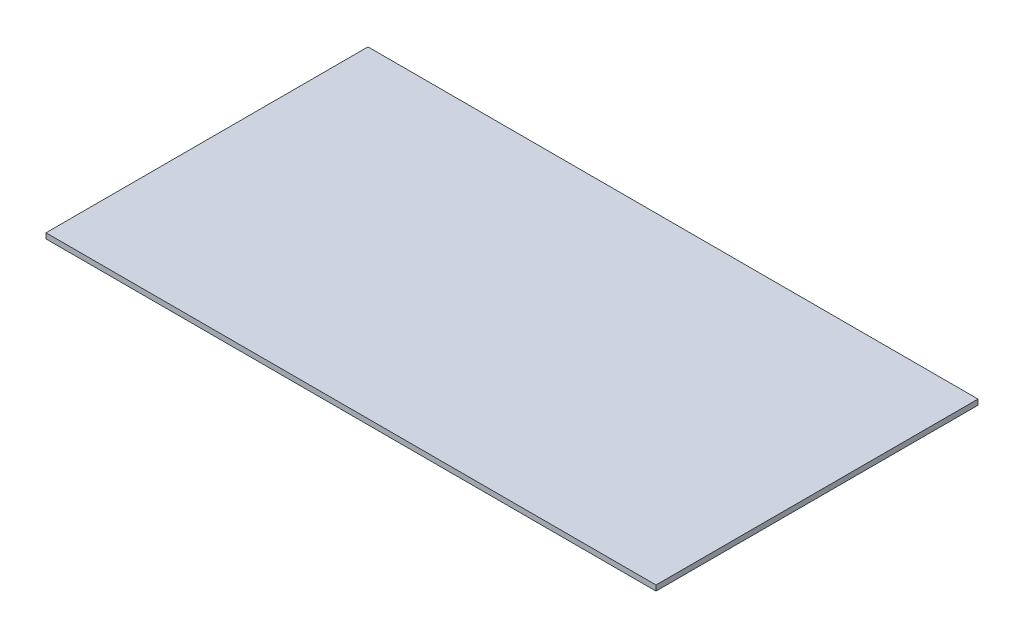
ISO-10303-21;
HEADER;
FILE_DESCRIPTION(('STEP AP214'),'2;1');
FILE_NAME('part.step','',(''),(''),'','','');
FILE_SCHEMA(('AUTOMOTIVE_DESIGN { 1 0 10303 214 1 1 1 1 }'));
ENDSEC;
DATA;
#1=APPLICATION_CONTEXT('core data for automotive mechanical design processes');
#2=APPLICATION_PROTOCOL_DEFINITION('international standard','automotive_design',2000,#1);
#3=PRODUCT_CONTEXT('',#1,'mechanical');
#4=PRODUCT('Part','Part','',(#3));
#5=PRODUCT_RELATED_PRODUCT_CATEGORY('part','',(#4));
#6=PRODUCT_DEFINITION_FORMATION('','',#4);
#7=PRODUCT_DEFINITION_CONTEXT('part definition',#1,'design');
#8=PRODUCT_DEFINITION('design','',#6,#7);
#9=PRODUCT_DEFINITION_SHAPE('','',#8);
#10=(LENGTH_UNIT() NAMED_UNIT(*) SI_UNIT(.MILLI.,.METRE.));
#11=(NAMED_UNIT(*) PLANE_ANGLE_UNIT() SI_UNIT($,.RADIAN.));
#12=(NAMED_UNIT(*) SI_UNIT($,.STERADIAN.) SOLID_ANGLE_UNIT());
#13=UNCERTAINTY_MEASURE_WITH_UNIT(LENGTH_MEASURE(1.E-05),#10,'distance_accuracy_value','');
#14=(GEOMETRIC_REPRESENTATION_CONTEXT(3) GLOBAL_UNCERTAINTY_ASSIGNED_CONTEXT((#13)) GLOBAL_UNIT_ASSIGNED_CONTEXT((#10,
#11,#12)) REPRESENTATION_CONTEXT('',''));
#15=CARTESIAN_POINT('',(0.,0.,0.));
#16=DIRECTION('',(0.,0.,1.));
#17=DIRECTION('',(1.,0.,0.));
#18=AXIS2_PLACEMENT_3D('',#15,#16,#17);
#19=CARTESIAN_POINT('',(-36.865031966129,4.44168168612903,287.));
#20=DIRECTION('',(-1.,0.,0.));
#21=DIRECTION('',(0.,0.,1.));
#22=AXIS2_PLACEMENT_3D('',#19,#20,#21);
#23=PLANE('',#22);
#24=DIRECTION('',(0.,1.,0.));
#25=VECTOR('',#24,1.);
#26=CARTESIAN_POINT('',(-36.865031966129,4.44168168612903,0.));
#27=LINE('',#26,#25);
#28=CARTESIAN_POINT('',(-36.865031966129,-0.320818313871037,0.));
#29=VERTEX_POINT('',#28);
#30=CARTESIAN_POINT('',(-36.865031966129,4.44168168612903,0.));
#31=VERTEX_POINT('',#30);
#32=EDGE_CURVE('E106',#29,#31,#27,.T.);
#33=ORIENTED_EDGE('',*,*,#32,.T.);
#34=DIRECTION('',(0.,0.,-1.));
#35=VECTOR('',#34,1.);
#36=CARTESIAN_POINT('',(-36.865031966129,4.44168168612903,287.));
#37=LINE('',#36,#35);
#38=CARTESIAN_POINT('',(-36.865031966129,4.44168168612903,287.));
#39=VERTEX_POINT('',#38);
#40=EDGE_CURVE('E11',#39,#31,#37,.T.);
#41=ORIENTED_EDGE('',*,*,#40,.F.);
#42=DIRECTION('',(0.,1.,0.));
#43=VECTOR('',#42,1.);
#44=CARTESIAN_POINT('',(-36.865031966129,4.44168168612903,287.));
#45=LINE('',#44,#43);
#46=CARTESIAN_POINT('',(-36.865031966129,-0.320818313871037,287.));
#47=VERTEX_POINT('',#46);
#48=EDGE_CURVE('E94',#47,#39,#45,.T.);
#49=ORIENTED_EDGE('',*,*,#48,.F.);
#50=DIRECTION('',(0.,0.,-1.));
#51=VECTOR('',#50,1.);
#52=CARTESIAN_POINT('',(-36.865031966129,-0.320818313871037,287.));
#53=LINE('',#52,#51);
#54=EDGE_CURVE('E102',#47,#29,#53,.T.);
#55=ORIENTED_EDGE('',*,*,#54,.T.);
#56=EDGE_LOOP('',(#33,#41,#49,#55));
#57=FACE_BOUND('',#56,.T.);
#58=ADVANCED_FACE('F43',(#57),#23,.F.);
#59=CARTESIAN_POINT('',(-580.595031966129,4.44168168612896,287.));
#60=DIRECTION('',(0.,-1.,0.));
#61=DIRECTION('',(1.,0.,0.));
#62=AXIS2_PLACEMENT_3D('',#59,#60,#61);
#63=PLANE('',#62);
#64=DIRECTION('',(-1.,0.,0.));
#65=VECTOR('',#64,1.);
#66=CARTESIAN_POINT('',(-580.595031966129,4.44168168612896,0.));
#67=LINE('',#66,#65);
#68=CARTESIAN_POINT('',(-580.595031966129,4.44168168612896,0.));
#69=VERTEX_POINT('',#68);
#70=EDGE_CURVE('E98',#31,#69,#67,.T.);
#71=ORIENTED_EDGE('',*,*,#70,.T.);
#72=DIRECTION('',(0.,0.,-1.));
#73=VECTOR('',#72,1.);
#74=CARTESIAN_POINT('',(-580.595031966129,4.44168168612896,287.));
#75=LINE('',#74,#73);
#76=CARTESIAN_POINT('',(-580.595031966129,4.44168168612896,287.));
#77=VERTEX_POINT('',#76);
#78=EDGE_CURVE('E51',#77,#69,#75,.T.);
#79=ORIENTED_EDGE('',*,*,#78,.F.);
#80=DIRECTION('',(-1.,0.,0.));
#81=VECTOR('',#80,1.);
#82=CARTESIAN_POINT('',(-580.595031966129,4.44168168612896,287.));
#83=LINE('',#82,#81);
#84=EDGE_CURVE('E89',#39,#77,#83,.T.);
#85=ORIENTED_EDGE('',*,*,#84,.F.);
#86=ORIENTED_EDGE('',*,*,#40,.T.);
#87=EDGE_LOOP('',(#71,#79,#85,#86));
#88=FACE_BOUND('',#87,.T.);
#89=ADVANCED_FACE('F97',(#88),#63,.F.);
#90=CARTESIAN_POINT('',(-580.595031966129,4.44168168612896,287.));
#91=DIRECTION('',(1.,0.,0.));
#92=DIRECTION('',(0.,0.,-1.));
#93=AXIS2_PLACEMENT_3D('',#90,#91,#92);
#94=PLANE('',#93);
#95=DIRECTION('',(0.,-1.,0.));
#96=VECTOR('',#95,1.);
#97=CARTESIAN_POINT('',(-580.595031966129,4.44168168612896,0.));
#98=LINE('',#97,#96);
#99=CARTESIAN_POINT('',(-580.595031966129,-0.320818313871104,0.));
#100=VERTEX_POINT('',#99);
#101=EDGE_CURVE('E76',#69,#100,#98,.T.);
#102=ORIENTED_EDGE('',*,*,#101,.T.);
#103=DIRECTION('',(0.,0.,-1.));
#104=VECTOR('',#103,1.);
#105=CARTESIAN_POINT('',(-580.595031966129,-0.320818313871104,287.));
#106=LINE('',#105,#104);
#107=CARTESIAN_POINT('',(-580.595031966129,-0.320818313871104,287.));
#108=VERTEX_POINT('',#107);
#109=EDGE_CURVE('E99',#108,#100,#106,.T.);
#110=ORIENTED_EDGE('',*,*,#109,.F.);
#111=DIRECTION('',(0.,-1.,0.));
#112=VECTOR('',#111,1.);
#113=CARTESIAN_POINT('',(-580.595031966129,4.44168168612896,287.));
#114=LINE('',#113,#112);
#115=EDGE_CURVE('E92',#77,#108,#114,.T.);
#116=ORIENTED_EDGE('',*,*,#115,.F.);
#117=ORIENTED_EDGE('',*,*,#78,.T.);
#118=EDGE_LOOP('',(#102,#110,#116,#117));
#119=FACE_BOUND('',#118,.T.);
#120=ADVANCED_FACE('F100',(#119),#94,.F.);
#121=CARTESIAN_POINT('',(-36.865031966129,-0.320818313871037,287.));
#122=DIRECTION('',(0.,1.,0.));
#123=DIRECTION('',(-1.,0.,0.));
#124=AXIS2_PLACEMENT_3D('',#121,#122,#123);
#125=PLANE('',#124);
#126=DIRECTION('',(1.,0.,0.));
#127=VECTOR('',#126,1.);
#128=CARTESIAN_POINT('',(-36.865031966129,-0.320818313871037,0.));
#129=LINE('',#128,#127);
#130=EDGE_CURVE('E82',#100,#29,#129,.T.);
#131=ORIENTED_EDGE('',*,*,#130,.T.);
#132=ORIENTED_EDGE('',*,*,#54,.F.);
#133=DIRECTION('',(1.,0.,0.));
#134=VECTOR('',#133,1.);
#135=CARTESIAN_POINT('',(-36.865031966129,-0.320818313871037,287.));
#136=LINE('',#135,#134);
#137=EDGE_CURVE('E59',#108,#47,#136,.T.);
#138=ORIENTED_EDGE('',*,*,#137,.F.);
#139=ORIENTED_EDGE('',*,*,#109,.T.);
#140=EDGE_LOOP('',(#131,#132,#138,#139));
#141=FACE_BOUND('',#140,.T.);
#142=ADVANCED_FACE('F113',(#141),#125,.F.);
#143=CARTESIAN_POINT('',(0.,0.,287.));
#144=DIRECTION('',(0.,0.,-1.));
#145=DIRECTION('',(-1.,0.,0.));
#146=AXIS2_PLACEMENT_3D('',#143,#144,#145);
#147=PLANE('',#146);
#148=ORIENTED_EDGE('',*,*,#48,.T.);
#149=ORIENTED_EDGE('',*,*,#84,.T.);
#150=ORIENTED_EDGE('',*,*,#115,.T.);
#151=ORIENTED_EDGE('',*,*,#137,.T.);
#152=EDGE_LOOP('',(#148,#149,#150,#151));
#153=FACE_BOUND('',#152,.T.);
#154=ADVANCED_FACE('F90',(#153),#147,.F.);
#155=CARTESIAN_POINT('',(0.,0.,0.));
#156=DIRECTION('',(0.,0.,-1.));
#157=DIRECTION('',(-1.,0.,0.));
#158=AXIS2_PLACEMENT_3D('',#155,#156,#157);
#159=PLANE('',#158);
#160=ORIENTED_EDGE('',*,*,#32,.F.);
#161=ORIENTED_EDGE('',*,*,#130,.F.);
#162=ORIENTED_EDGE('',*,*,#101,.F.);
#163=ORIENTED_EDGE('',*,*,#70,.F.);
#164=EDGE_LOOP('',(#160,#161,#162,#163));
#165=FACE_BOUND('',#164,.T.);
#166=ADVANCED_FACE('F116',(#165),#159,.T.);
#167=CLOSED_SHELL('',(#58,#89,#120,#142,#154,#166));
#168=MANIFOLD_SOLID_BREP('B2',#167);
#169=ADVANCED_BREP_SHAPE_REPRESENTATION('',(#18,#168),#14);
#170=SHAPE_DEFINITION_REPRESENTATION(#9,#169);
ENDSEC;
END-ISO-10303-21;
